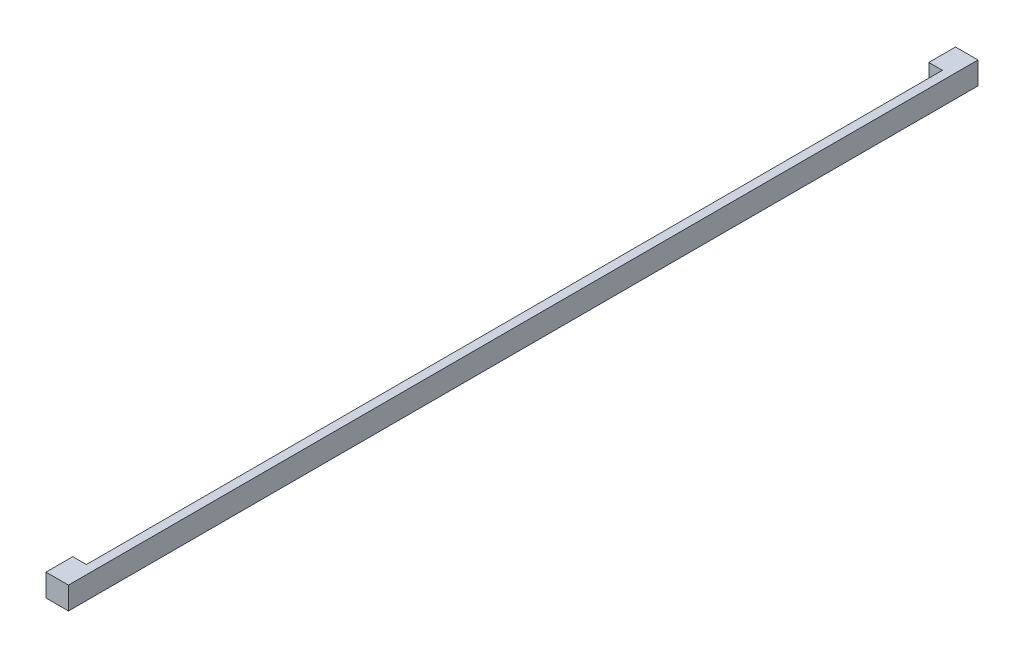
ISO-10303-21;
HEADER;
FILE_DESCRIPTION(('STEP AP214'),'2;1');
FILE_NAME('part.step','',(''),(''),'','','');
FILE_SCHEMA(('AUTOMOTIVE_DESIGN { 1 0 10303 214 1 1 1 1 }'));
ENDSEC;
DATA;
#1=APPLICATION_CONTEXT('core data for automotive mechanical design processes');
#2=APPLICATION_PROTOCOL_DEFINITION('international standard','automotive_design',2000,#1);
#3=PRODUCT_CONTEXT('',#1,'mechanical');
#4=PRODUCT('Part','Part','',(#3));
#5=PRODUCT_RELATED_PRODUCT_CATEGORY('part','',(#4));
#6=PRODUCT_DEFINITION_FORMATION('','',#4);
#7=PRODUCT_DEFINITION_CONTEXT('part definition',#1,'design');
#8=PRODUCT_DEFINITION('design','',#6,#7);
#9=PRODUCT_DEFINITION_SHAPE('','',#8);
#10=(LENGTH_UNIT() NAMED_UNIT(*) SI_UNIT(.MILLI.,.METRE.));
#11=(NAMED_UNIT(*) PLANE_ANGLE_UNIT() SI_UNIT($,.RADIAN.));
#12=(NAMED_UNIT(*) SI_UNIT($,.STERADIAN.) SOLID_ANGLE_UNIT());
#13=UNCERTAINTY_MEASURE_WITH_UNIT(LENGTH_MEASURE(1.E-05),#10,'distance_accuracy_value','');
#14=(GEOMETRIC_REPRESENTATION_CONTEXT(3) GLOBAL_UNCERTAINTY_ASSIGNED_CONTEXT((#13)) GLOBAL_UNIT_ASSIGNED_CONTEXT((#10,
#11,#12)) REPRESENTATION_CONTEXT('',''));
#15=CARTESIAN_POINT('',(0.,0.,0.));
#16=DIRECTION('',(0.,0.,1.));
#17=DIRECTION('',(1.,0.,0.));
#18=AXIS2_PLACEMENT_3D('',#15,#16,#17);
#19=CARTESIAN_POINT('',(4.2,-4.2,340.));
#20=DIRECTION('',(-1.,0.,0.));
#21=DIRECTION('',(0.,0.,1.));
#22=AXIS2_PLACEMENT_3D('',#19,#20,#21);
#23=PLANE('',#22);
#24=DIRECTION('',(0.,1.,0.));
#25=VECTOR('',#24,1.);
#26=CARTESIAN_POINT('',(4.2,-4.2,0.));
#27=LINE('',#26,#25);
#28=CARTESIAN_POINT('',(4.2,-4.2,0.));
#29=VERTEX_POINT('',#28);
#30=CARTESIAN_POINT('',(4.2,4.2,0.));
#31=VERTEX_POINT('',#30);
#32=EDGE_CURVE('E138',#29,#31,#27,.T.);
#33=ORIENTED_EDGE('',*,*,#32,.T.);
#34=DIRECTION('',(0.,0.,-1.));
#35=VECTOR('',#34,1.);
#36=CARTESIAN_POINT('',(4.2,4.2,340.));
#37=LINE('',#36,#35);
#38=CARTESIAN_POINT('',(4.2,4.2,340.));
#39=VERTEX_POINT('',#38);
#40=EDGE_CURVE('E162',#39,#31,#37,.T.);
#41=ORIENTED_EDGE('',*,*,#40,.F.);
#42=DIRECTION('',(0.,1.,0.));
#43=VECTOR('',#42,1.);
#44=CARTESIAN_POINT('',(4.2,-4.2,340.));
#45=LINE('',#44,#43);
#46=CARTESIAN_POINT('',(4.2,-4.2,340.));
#47=VERTEX_POINT('',#46);
#48=EDGE_CURVE('E140',#47,#39,#45,.T.);
#49=ORIENTED_EDGE('',*,*,#48,.F.);
#50=DIRECTION('',(0.,0.,-1.));
#51=VECTOR('',#50,1.);
#52=CARTESIAN_POINT('',(4.2,-4.2,340.));
#53=LINE('',#52,#51);
#54=EDGE_CURVE('E146',#47,#29,#53,.T.);
#55=ORIENTED_EDGE('',*,*,#54,.T.);
#56=EDGE_LOOP('',(#33,#41,#49,#55));
#57=FACE_BOUND('',#56,.T.);
#58=ADVANCED_FACE('F36',(#57),#23,.F.);
#59=CARTESIAN_POINT('',(-4.2,4.2,340.));
#60=DIRECTION('',(0.,-1.,0.));
#61=DIRECTION('',(0.,0.,-1.));
#62=AXIS2_PLACEMENT_3D('',#59,#60,#61);
#63=PLANE('',#62);
#64=DIRECTION('',(0.,0.,-1.));
#65=VECTOR('',#64,1.);
#66=CARTESIAN_POINT('',(-4.2,4.2,340.));
#67=LINE('',#66,#65);
#68=CARTESIAN_POINT('',(-4.2,4.2,10.));
#69=VERTEX_POINT('',#68);
#70=CARTESIAN_POINT('',(-4.2,4.2,0.));
#71=VERTEX_POINT('',#70);
#72=EDGE_CURVE('E158',#69,#71,#67,.T.);
#73=ORIENTED_EDGE('',*,*,#72,.F.);
#74=DIRECTION('',(-1.,0.,0.));
#75=VECTOR('',#74,1.);
#76=CARTESIAN_POINT('',(-14.8600970127145,4.2,10.));
#77=LINE('',#76,#75);
#78=CARTESIAN_POINT('',(0.900000000000001,4.2,10.));
#79=VERTEX_POINT('',#78);
#80=EDGE_CURVE('E118',#79,#69,#77,.T.);
#81=ORIENTED_EDGE('',*,*,#80,.F.);
#82=DIRECTION('',(0.,0.,-1.));
#83=VECTOR('',#82,1.);
#84=CARTESIAN_POINT('',(0.900000000000001,4.2,10.));
#85=LINE('',#84,#83);
#86=CARTESIAN_POINT('',(0.900000000000036,4.2,330.));
#87=VERTEX_POINT('',#86);
#88=EDGE_CURVE('E135',#87,#79,#85,.T.);
#89=ORIENTED_EDGE('',*,*,#88,.F.);
#90=DIRECTION('',(1.,0.,0.));
#91=VECTOR('',#90,1.);
#92=CARTESIAN_POINT('',(-14.8600970127145,4.2,330.));
#93=LINE('',#92,#91);
#94=CARTESIAN_POINT('',(-4.2,4.2,330.));
#95=VERTEX_POINT('',#94);
#96=EDGE_CURVE('E124',#95,#87,#93,.T.);
#97=ORIENTED_EDGE('',*,*,#96,.F.);
#98=CARTESIAN_POINT('',(-4.2,4.2,340.));
#99=VERTEX_POINT('',#98);
#100=EDGE_CURVE('E159',#99,#95,#67,.T.);
#101=ORIENTED_EDGE('',*,*,#100,.F.);
#102=DIRECTION('',(-1.,0.,0.));
#103=VECTOR('',#102,1.);
#104=CARTESIAN_POINT('',(-4.2,4.2,340.));
#105=LINE('',#104,#103);
#106=EDGE_CURVE('E88',#39,#99,#105,.T.);
#107=ORIENTED_EDGE('',*,*,#106,.F.);
#108=ORIENTED_EDGE('',*,*,#40,.T.);
#109=DIRECTION('',(-1.,0.,0.));
#110=VECTOR('',#109,1.);
#111=CARTESIAN_POINT('',(-4.2,4.2,0.));
#112=LINE('',#111,#110);
#113=EDGE_CURVE('E149',#31,#71,#112,.T.);
#114=ORIENTED_EDGE('',*,*,#113,.T.);
#115=EDGE_LOOP('',(#73,#81,#89,#97,#101,#107,#108,#114));
#116=FACE_BOUND('',#115,.T.);
#117=ADVANCED_FACE('F168',(#116),#63,.F.);
#118=CARTESIAN_POINT('',(-4.2,-4.2,340.));
#119=DIRECTION('',(1.,0.,0.));
#120=DIRECTION('',(0.,0.,-1.));
#121=AXIS2_PLACEMENT_3D('',#118,#119,#120);
#122=PLANE('',#121);
#123=DIRECTION('',(0.,0.,1.));
#124=VECTOR('',#123,1.);
#125=CARTESIAN_POINT('',(-4.2,-0.9,340.));
#126=LINE('',#125,#124);
#127=CARTESIAN_POINT('',(-4.2,-0.9,9.99999999999995));
#128=VERTEX_POINT('',#127);
#129=CARTESIAN_POINT('',(-4.2,-0.9,330.));
#130=VERTEX_POINT('',#129);
#131=EDGE_CURVE('E115',#128,#130,#126,.T.);
#132=ORIENTED_EDGE('',*,*,#131,.F.);
#133=DIRECTION('',(0.,1.,0.));
#134=VECTOR('',#133,1.);
#135=CARTESIAN_POINT('',(-4.2,-4.2,10.));
#136=LINE('',#135,#134);
#137=EDGE_CURVE('E11',#128,#69,#136,.T.);
#138=ORIENTED_EDGE('',*,*,#137,.T.);
#139=ORIENTED_EDGE('',*,*,#72,.T.);
#140=DIRECTION('',(0.,-1.,0.));
#141=VECTOR('',#140,1.);
#142=CARTESIAN_POINT('',(-4.2,-4.2,0.));
#143=LINE('',#142,#141);
#144=CARTESIAN_POINT('',(-4.2,-4.2,0.));
#145=VERTEX_POINT('',#144);
#146=EDGE_CURVE('E152',#71,#145,#143,.T.);
#147=ORIENTED_EDGE('',*,*,#146,.T.);
#148=DIRECTION('',(0.,0.,-1.));
#149=VECTOR('',#148,1.);
#150=CARTESIAN_POINT('',(-4.2,-4.2,340.));
#151=LINE('',#150,#149);
#152=CARTESIAN_POINT('',(-4.2,-4.2,340.));
#153=VERTEX_POINT('',#152);
#154=EDGE_CURVE('E156',#153,#145,#151,.T.);
#155=ORIENTED_EDGE('',*,*,#154,.F.);
#156=DIRECTION('',(0.,-1.,0.));
#157=VECTOR('',#156,1.);
#158=CARTESIAN_POINT('',(-4.2,-4.2,340.));
#159=LINE('',#158,#157);
#160=EDGE_CURVE('E143',#99,#153,#159,.T.);
#161=ORIENTED_EDGE('',*,*,#160,.F.);
#162=ORIENTED_EDGE('',*,*,#100,.T.);
#163=DIRECTION('',(0.,-1.,0.));
#164=VECTOR('',#163,1.);
#165=CARTESIAN_POINT('',(-4.2,-4.2,330.));
#166=LINE('',#165,#164);
#167=EDGE_CURVE('E43',#95,#130,#166,.T.);
#168=ORIENTED_EDGE('',*,*,#167,.T.);
#169=EDGE_LOOP('',(#132,#138,#139,#147,#155,#161,#162,#168));
#170=FACE_BOUND('',#169,.T.);
#171=ADVANCED_FACE('F165',(#170),#122,.F.);
#172=CARTESIAN_POINT('',(-4.2,-4.2,340.));
#173=DIRECTION('',(0.,1.,0.));
#174=DIRECTION('',(0.,0.,1.));
#175=AXIS2_PLACEMENT_3D('',#172,#173,#174);
#176=PLANE('',#175);
#177=DIRECTION('',(1.,0.,0.));
#178=VECTOR('',#177,1.);
#179=CARTESIAN_POINT('',(-4.2,-4.2,0.));
#180=LINE('',#179,#178);
#181=EDGE_CURVE('E80',#145,#29,#180,.T.);
#182=ORIENTED_EDGE('',*,*,#181,.T.);
#183=ORIENTED_EDGE('',*,*,#54,.F.);
#184=DIRECTION('',(1.,0.,0.));
#185=VECTOR('',#184,1.);
#186=CARTESIAN_POINT('',(-4.2,-4.2,340.));
#187=LINE('',#186,#185);
#188=EDGE_CURVE('E59',#153,#47,#187,.T.);
#189=ORIENTED_EDGE('',*,*,#188,.F.);
#190=ORIENTED_EDGE('',*,*,#154,.T.);
#191=EDGE_LOOP('',(#182,#183,#189,#190));
#192=FACE_BOUND('',#191,.T.);
#193=ADVANCED_FACE('F180',(#192),#176,.F.);
#194=CARTESIAN_POINT('',(0.,0.,340.));
#195=DIRECTION('',(0.,0.,-1.));
#196=DIRECTION('',(-1.,0.,0.));
#197=AXIS2_PLACEMENT_3D('',#194,#195,#196);
#198=PLANE('',#197);
#199=ORIENTED_EDGE('',*,*,#48,.T.);
#200=ORIENTED_EDGE('',*,*,#106,.T.);
#201=ORIENTED_EDGE('',*,*,#160,.T.);
#202=ORIENTED_EDGE('',*,*,#188,.T.);
#203=EDGE_LOOP('',(#199,#200,#201,#202));
#204=FACE_BOUND('',#203,.T.);
#205=ADVANCED_FACE('F181',(#204),#198,.F.);
#206=CARTESIAN_POINT('',(0.,0.,0.));
#207=DIRECTION('',(0.,0.,-1.));
#208=DIRECTION('',(-1.,0.,0.));
#209=AXIS2_PLACEMENT_3D('',#206,#207,#208);
#210=PLANE('',#209);
#211=ORIENTED_EDGE('',*,*,#32,.F.);
#212=ORIENTED_EDGE('',*,*,#181,.F.);
#213=ORIENTED_EDGE('',*,*,#146,.F.);
#214=ORIENTED_EDGE('',*,*,#113,.F.);
#215=EDGE_LOOP('',(#211,#212,#213,#214));
#216=FACE_BOUND('',#215,.T.);
#217=ADVANCED_FACE('F177',(#216),#210,.T.);
#218=CARTESIAN_POINT('',(-14.8600970127145,-0.9,10.));
#219=DIRECTION('',(0.,0.,-1.));
#220=DIRECTION('',(-1.,0.,0.));
#221=AXIS2_PLACEMENT_3D('',#218,#219,#220);
#222=PLANE('',#221);
#223=DIRECTION('',(-1.,0.,0.));
#224=VECTOR('',#223,1.);
#225=CARTESIAN_POINT('',(-14.8600970127145,-0.9,10.));
#226=LINE('',#225,#224);
#227=CARTESIAN_POINT('',(0.900000000000001,-0.9,10.));
#228=VERTEX_POINT('',#227);
#229=EDGE_CURVE('E50',#228,#128,#226,.T.);
#230=ORIENTED_EDGE('',*,*,#229,.F.);
#231=DIRECTION('',(0.,1.,0.));
#232=VECTOR('',#231,1.);
#233=CARTESIAN_POINT('',(0.900000000000001,-0.9,10.));
#234=LINE('',#233,#232);
#235=EDGE_CURVE('E128',#228,#79,#234,.T.);
#236=ORIENTED_EDGE('',*,*,#235,.T.);
#237=ORIENTED_EDGE('',*,*,#80,.T.);
#238=ORIENTED_EDGE('',*,*,#137,.F.);
#239=EDGE_LOOP('',(#230,#236,#237,#238));
#240=FACE_BOUND('',#239,.T.);
#241=ADVANCED_FACE('F171',(#240),#222,.F.);
#242=CARTESIAN_POINT('',(-14.8600970127145,-0.9,330.));
#243=DIRECTION('',(0.,0.,1.));
#244=DIRECTION('',(1.,0.,0.));
#245=AXIS2_PLACEMENT_3D('',#242,#243,#244);
#246=PLANE('',#245);
#247=ORIENTED_EDGE('',*,*,#96,.T.);
#248=DIRECTION('',(0.,1.,0.));
#249=VECTOR('',#248,1.);
#250=CARTESIAN_POINT('',(0.900000000000036,-0.9,330.));
#251=LINE('',#250,#249);
#252=CARTESIAN_POINT('',(0.900000000000036,-0.9,330.));
#253=VERTEX_POINT('',#252);
#254=EDGE_CURVE('E121',#253,#87,#251,.T.);
#255=ORIENTED_EDGE('',*,*,#254,.F.);
#256=DIRECTION('',(1.,0.,0.));
#257=VECTOR('',#256,1.);
#258=CARTESIAN_POINT('',(-14.8600970127145,-0.9,330.));
#259=LINE('',#258,#257);
#260=EDGE_CURVE('E109',#130,#253,#259,.T.);
#261=ORIENTED_EDGE('',*,*,#260,.F.);
#262=ORIENTED_EDGE('',*,*,#167,.F.);
#263=EDGE_LOOP('',(#247,#255,#261,#262));
#264=FACE_BOUND('',#263,.T.);
#265=ADVANCED_FACE('F122',(#264),#246,.F.);
#266=CARTESIAN_POINT('',(0.,-0.9,0.));
#267=DIRECTION('',(0.,1.,0.));
#268=DIRECTION('',(0.,0.,1.));
#269=AXIS2_PLACEMENT_3D('',#266,#267,#268);
#270=PLANE('',#269);
#271=ORIENTED_EDGE('',*,*,#131,.T.);
#272=ORIENTED_EDGE('',*,*,#260,.T.);
#273=DIRECTION('',(0.,0.,-1.));
#274=VECTOR('',#273,1.);
#275=CARTESIAN_POINT('',(0.900000000000001,-0.9,10.));
#276=LINE('',#275,#274);
#277=EDGE_CURVE('E113',#253,#228,#276,.T.);
#278=ORIENTED_EDGE('',*,*,#277,.T.);
#279=ORIENTED_EDGE('',*,*,#229,.T.);
#280=EDGE_LOOP('',(#271,#272,#278,#279));
#281=FACE_BOUND('',#280,.T.);
#282=ADVANCED_FACE('F111',(#281),#270,.T.);
#283=CARTESIAN_POINT('',(0.900000000000001,-0.9,10.));
#284=DIRECTION('',(1.,0.,0.));
#285=DIRECTION('',(0.,0.,-1.));
#286=AXIS2_PLACEMENT_3D('',#283,#284,#285);
#287=PLANE('',#286);
#288=ORIENTED_EDGE('',*,*,#88,.T.);
#289=ORIENTED_EDGE('',*,*,#235,.F.);
#290=ORIENTED_EDGE('',*,*,#277,.F.);
#291=ORIENTED_EDGE('',*,*,#254,.T.);
#292=EDGE_LOOP('',(#288,#289,#290,#291));
#293=FACE_BOUND('',#292,.T.);
#294=ADVANCED_FACE('F130',(#293),#287,.F.);
#295=CLOSED_SHELL('',(#58,#117,#171,#193,#205,#217,#241,#265,#282,#294));
#296=MANIFOLD_SOLID_BREP('B2',#295);
#297=ADVANCED_BREP_SHAPE_REPRESENTATION('',(#18,#296),#14);
#298=SHAPE_DEFINITION_REPRESENTATION(#9,#297);
ENDSEC;
END-ISO-10303-21;
